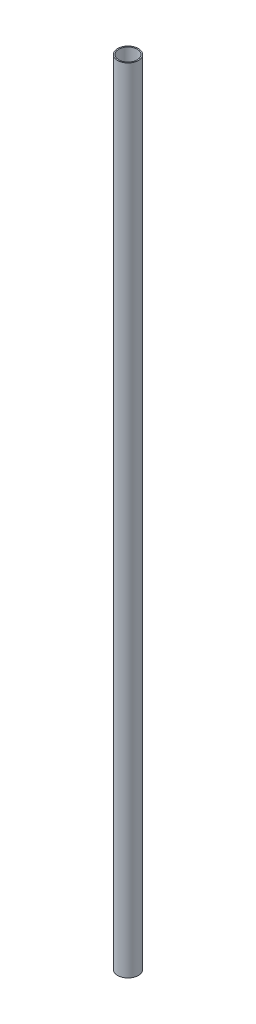
ISO-10303-21;
HEADER;
FILE_DESCRIPTION(('STEP AP214'),'2;1');
FILE_NAME('part.step','',(''),(''),'','','');
FILE_SCHEMA(('AUTOMOTIVE_DESIGN { 1 0 10303 214 1 1 1 1 }'));
ENDSEC;
DATA;
#1=APPLICATION_CONTEXT('core data for automotive mechanical design processes');
#2=APPLICATION_PROTOCOL_DEFINITION('international standard','automotive_design',2000,#1);
#3=PRODUCT_CONTEXT('',#1,'mechanical');
#4=PRODUCT('Part','Part','',(#3));
#5=PRODUCT_RELATED_PRODUCT_CATEGORY('part','',(#4));
#6=PRODUCT_DEFINITION_FORMATION('','',#4);
#7=PRODUCT_DEFINITION_CONTEXT('part definition',#1,'design');
#8=PRODUCT_DEFINITION('design','',#6,#7);
#9=PRODUCT_DEFINITION_SHAPE('','',#8);
#10=(LENGTH_UNIT() NAMED_UNIT(*) SI_UNIT(.MILLI.,.METRE.));
#11=(NAMED_UNIT(*) PLANE_ANGLE_UNIT() SI_UNIT($,.RADIAN.));
#12=(NAMED_UNIT(*) SI_UNIT($,.STERADIAN.) SOLID_ANGLE_UNIT());
#13=UNCERTAINTY_MEASURE_WITH_UNIT(LENGTH_MEASURE(1.E-05),#10,'distance_accuracy_value','');
#14=(GEOMETRIC_REPRESENTATION_CONTEXT(3) GLOBAL_UNCERTAINTY_ASSIGNED_CONTEXT((#13)) GLOBAL_UNIT_ASSIGNED_CONTEXT((#10,
#11,#12)) REPRESENTATION_CONTEXT('',''));
#15=CARTESIAN_POINT('',(0.,0.,0.));
#16=DIRECTION('',(0.,0.,1.));
#17=DIRECTION('',(1.,0.,0.));
#18=AXIS2_PLACEMENT_3D('',#15,#16,#17);
#19=CARTESIAN_POINT('',(0.,-241.3,0.));
#20=DIRECTION('',(0.,1.,0.));
#21=DIRECTION('',(0.,0.,1.));
#22=AXIS2_PLACEMENT_3D('',#19,#20,#21);
#23=CYLINDRICAL_SURFACE('',#22,6.35);
#24=CARTESIAN_POINT('',(0.,-241.3,0.));
#25=DIRECTION('',(0.,1.,0.));
#26=DIRECTION('',(0.,0.,1.));
#27=AXIS2_PLACEMENT_3D('',#24,#25,#26);
#28=CIRCLE('',#27,6.35);
#29=CARTESIAN_POINT('',(0.,-241.3,6.35));
#30=VERTEX_POINT('',#29);
#31=EDGE_CURVE('E10',#30,#30,#28,.T.);
#32=CARTESIAN_POINT('',(0.,241.3,0.));
#33=DIRECTION('',(0.,1.,0.));
#34=DIRECTION('',(0.,0.,1.));
#35=AXIS2_PLACEMENT_3D('',#32,#33,#34);
#36=CIRCLE('',#35,6.35);
#37=CARTESIAN_POINT('',(0.,241.3,6.35));
#38=VERTEX_POINT('',#37);
#39=EDGE_CURVE('E47',#38,#38,#36,.T.);
#40=CARTESIAN_POINT('',(0.,-241.3,6.35));
#41=CARTESIAN_POINT('',(0.,-236.272916666667,6.35));
#42=CARTESIAN_POINT('',(0.,-231.245833333333,6.35));
#43=CARTESIAN_POINT('',(0.,-221.191666666667,6.35));
#44=CARTESIAN_POINT('',(0.,-216.164583333333,6.35));
#45=CARTESIAN_POINT('',(0.,-206.110416666667,6.35));
#46=CARTESIAN_POINT('',(0.,-201.083333333333,6.35));
#47=CARTESIAN_POINT('',(0.,-191.029166666667,6.35));
#48=CARTESIAN_POINT('',(0.,-186.002083333333,6.35));
#49=CARTESIAN_POINT('',(0.,-175.947916666667,6.35));
#50=CARTESIAN_POINT('',(0.,-170.920833333333,6.35));
#51=CARTESIAN_POINT('',(0.,-160.866666666667,6.35));
#52=CARTESIAN_POINT('',(0.,-155.839583333333,6.35));
#53=CARTESIAN_POINT('',(0.,-145.785416666667,6.35));
#54=CARTESIAN_POINT('',(0.,-140.758333333333,6.35));
#55=CARTESIAN_POINT('',(0.,-130.704166666667,6.35));
#56=CARTESIAN_POINT('',(0.,-125.677083333333,6.35));
#57=CARTESIAN_POINT('',(0.,-115.622916666667,6.35));
#58=CARTESIAN_POINT('',(0.,-110.595833333333,6.35));
#59=CARTESIAN_POINT('',(0.,-100.541666666667,6.35));
#60=CARTESIAN_POINT('',(0.,-95.5145833333334,6.35));
#61=CARTESIAN_POINT('',(0.,-85.4604166666667,6.35));
#62=CARTESIAN_POINT('',(0.,-80.4333333333334,6.35));
#63=CARTESIAN_POINT('',(0.,-70.3791666666667,6.35));
#64=CARTESIAN_POINT('',(0.,-65.3520833333334,6.35));
#65=CARTESIAN_POINT('',(0.,-55.2979166666667,6.35));
#66=CARTESIAN_POINT('',(0.,-50.2708333333334,6.35));
#67=CARTESIAN_POINT('',(0.,-40.2166666666667,6.35));
#68=CARTESIAN_POINT('',(0.,-35.1895833333334,6.35));
#69=CARTESIAN_POINT('',(0.,-25.1354166666667,6.35));
#70=CARTESIAN_POINT('',(0.,-20.1083333333334,6.35));
#71=CARTESIAN_POINT('',(0.,-10.0541666666667,6.35));
#72=CARTESIAN_POINT('',(0.,-5.02708333333336,6.35));
#73=CARTESIAN_POINT('',(0.,5.0270833333333,6.35));
#74=CARTESIAN_POINT('',(0.,10.0541666666666,6.35));
#75=CARTESIAN_POINT('',(0.,20.1083333333333,6.35));
#76=CARTESIAN_POINT('',(0.,25.1354166666666,6.35));
#77=CARTESIAN_POINT('',(0.,35.1895833333333,6.35));
#78=CARTESIAN_POINT('',(0.,40.2166666666666,6.35));
#79=CARTESIAN_POINT('',(0.,50.2708333333333,6.35));
#80=CARTESIAN_POINT('',(0.,55.2979166666667,6.35));
#81=CARTESIAN_POINT('',(0.,65.3520833333333,6.35));
#82=CARTESIAN_POINT('',(0.,70.3791666666666,6.35));
#83=CARTESIAN_POINT('',(0.,80.4333333333333,6.35));
#84=CARTESIAN_POINT('',(0.,85.4604166666666,6.35));
#85=CARTESIAN_POINT('',(0.,95.5145833333333,6.35));
#86=CARTESIAN_POINT('',(0.,100.541666666667,6.35));
#87=CARTESIAN_POINT('',(0.,110.595833333333,6.35));
#88=CARTESIAN_POINT('',(0.,115.622916666667,6.35));
#89=CARTESIAN_POINT('',(0.,125.677083333333,6.35));
#90=CARTESIAN_POINT('',(0.,130.704166666667,6.35));
#91=CARTESIAN_POINT('',(0.,140.758333333333,6.35));
#92=CARTESIAN_POINT('',(0.,145.785416666667,6.35));
#93=CARTESIAN_POINT('',(0.,155.839583333333,6.35));
#94=CARTESIAN_POINT('',(0.,160.866666666667,6.35));
#95=CARTESIAN_POINT('',(0.,170.920833333333,6.35));
#96=CARTESIAN_POINT('',(0.,175.947916666667,6.35));
#97=CARTESIAN_POINT('',(0.,186.002083333333,6.35));
#98=CARTESIAN_POINT('',(0.,191.029166666667,6.35));
#99=CARTESIAN_POINT('',(0.,201.083333333333,6.35));
#100=CARTESIAN_POINT('',(0.,206.110416666667,6.35));
#101=CARTESIAN_POINT('',(0.,216.164583333333,6.35));
#102=CARTESIAN_POINT('',(0.,221.191666666667,6.35));
#103=CARTESIAN_POINT('',(0.,231.245833333333,6.35));
#104=CARTESIAN_POINT('',(0.,236.272916666667,6.35));
#105=CARTESIAN_POINT('',(0.,241.3,6.35));
#106=B_SPLINE_CURVE_WITH_KNOTS('',3,(#40,#41,#42,#43,#44,#45,#46,#47,#48,#49,#50,#51,#52,#53,
#54,#55,#56,#57,#58,#59,#60,#61,#62,#63,#64,#65,#66,#67,#68,#69,#70,#71,#72,#73,#74,#75,#76,#77,
#78,#79,#80,#81,#82,#83,#84,#85,#86,#87,#88,#89,#90,#91,#92,#93,#94,#95,#96,#97,#98,#99,#100,
#101,#102,#103,#104,#105),.UNSPECIFIED.,.F.,.F.,(4,2,2,2,2,2,2,2,2,2,2,2,2,2,2,2,2,2,2,2,2,2,2,
2,2,2,2,2,2,2,2,2,4),(0.,15.08125,30.1625,45.24375,60.325,75.40625,90.4875,105.56875,120.65,
135.73125,150.8125,165.89375,180.975,196.05625,211.1375,226.21875,241.3,256.38125,271.4625,
286.54375,301.625,316.70625,331.7875,346.86875,361.95,377.03125,392.1125,407.19375,422.275,
437.35625,452.4375,467.51875,482.6),.UNSPECIFIED.);
#107=EDGE_CURVE('BSEAM37',#30,#38,#106,.T.);
#108=ORIENTED_EDGE('',*,*,#31,.T.);
#109=ORIENTED_EDGE('',*,*,#39,.F.);
#110=ORIENTED_EDGE('',*,*,#107,.T.);
#111=ORIENTED_EDGE('',*,*,#107,.F.);
#112=EDGE_LOOP('',(#108,#110,#109,#111));
#113=FACE_BOUND('',#112,.T.);
#114=ADVANCED_FACE('F37',(#113),#23,.T.);
#115=CARTESIAN_POINT('',(0.,-241.3,0.));
#116=DIRECTION('',(0.,1.,0.));
#117=DIRECTION('',(0.,0.,1.));
#118=AXIS2_PLACEMENT_3D('',#115,#116,#117);
#119=PLANE('',#118);
#120=CARTESIAN_POINT('',(0.,-241.3,0.));
#121=DIRECTION('',(0.,1.,0.));
#122=DIRECTION('',(0.,0.,1.));
#123=AXIS2_PLACEMENT_3D('',#120,#121,#122);
#124=CIRCLE('',#123,5.6134);
#125=CARTESIAN_POINT('',(0.,-241.3,5.6134));
#126=VERTEX_POINT('',#125);
#127=EDGE_CURVE('E43',#126,#126,#124,.T.);
#128=ORIENTED_EDGE('',*,*,#127,.T.);
#129=EDGE_LOOP('',(#128));
#130=FACE_BOUND('',#129,.T.);
#131=ORIENTED_EDGE('',*,*,#31,.F.);
#132=EDGE_LOOP('',(#131));
#133=FACE_BOUND('',#132,.T.);
#134=ADVANCED_FACE('F66',(#130,#133),#119,.F.);
#135=CARTESIAN_POINT('',(0.,-241.3,0.));
#136=DIRECTION('',(0.,1.,0.));
#137=DIRECTION('',(0.,0.,1.));
#138=AXIS2_PLACEMENT_3D('',#135,#136,#137);
#139=CYLINDRICAL_SURFACE('',#138,5.6134);
#140=CARTESIAN_POINT('',(0.,241.3,0.));
#141=DIRECTION('',(0.,1.,0.));
#142=DIRECTION('',(0.,0.,1.));
#143=AXIS2_PLACEMENT_3D('',#140,#141,#142);
#144=CIRCLE('',#143,5.6134);
#145=CARTESIAN_POINT('',(0.,241.3,5.6134));
#146=VERTEX_POINT('',#145);
#147=EDGE_CURVE('E51',#146,#146,#144,.T.);
#148=CARTESIAN_POINT('',(0.,-241.3,5.6134));
#149=CARTESIAN_POINT('',(0.,-236.272916666667,5.6134));
#150=CARTESIAN_POINT('',(0.,-231.245833333333,5.6134));
#151=CARTESIAN_POINT('',(0.,-221.191666666667,5.6134));
#152=CARTESIAN_POINT('',(0.,-216.164583333333,5.6134));
#153=CARTESIAN_POINT('',(0.,-206.110416666667,5.6134));
#154=CARTESIAN_POINT('',(0.,-201.083333333333,5.6134));
#155=CARTESIAN_POINT('',(0.,-191.029166666667,5.6134));
#156=CARTESIAN_POINT('',(0.,-186.002083333333,5.6134));
#157=CARTESIAN_POINT('',(0.,-175.947916666667,5.6134));
#158=CARTESIAN_POINT('',(0.,-170.920833333333,5.6134));
#159=CARTESIAN_POINT('',(0.,-160.866666666667,5.6134));
#160=CARTESIAN_POINT('',(0.,-155.839583333333,5.6134));
#161=CARTESIAN_POINT('',(0.,-145.785416666667,5.6134));
#162=CARTESIAN_POINT('',(0.,-140.758333333333,5.6134));
#163=CARTESIAN_POINT('',(0.,-130.704166666667,5.6134));
#164=CARTESIAN_POINT('',(0.,-125.677083333333,5.6134));
#165=CARTESIAN_POINT('',(0.,-115.622916666667,5.6134));
#166=CARTESIAN_POINT('',(0.,-110.595833333333,5.6134));
#167=CARTESIAN_POINT('',(0.,-100.541666666667,5.6134));
#168=CARTESIAN_POINT('',(0.,-95.5145833333333,5.6134));
#169=CARTESIAN_POINT('',(0.,-85.4604166666667,5.6134));
#170=CARTESIAN_POINT('',(0.,-80.4333333333333,5.6134));
#171=CARTESIAN_POINT('',(0.,-70.3791666666667,5.6134));
#172=CARTESIAN_POINT('',(0.,-65.3520833333334,5.6134));
#173=CARTESIAN_POINT('',(0.,-55.2979166666667,5.6134));
#174=CARTESIAN_POINT('',(0.,-50.2708333333333,5.6134));
#175=CARTESIAN_POINT('',(0.,-40.2166666666667,5.6134));
#176=CARTESIAN_POINT('',(0.,-35.1895833333333,5.6134));
#177=CARTESIAN_POINT('',(0.,-25.1354166666667,5.6134));
#178=CARTESIAN_POINT('',(0.,-20.1083333333333,5.6134));
#179=CARTESIAN_POINT('',(0.,-10.0541666666667,5.6134));
#180=CARTESIAN_POINT('',(0.,-5.02708333333333,5.6134));
#181=CARTESIAN_POINT('',(0.,5.02708333333332,5.6134));
#182=CARTESIAN_POINT('',(0.,10.0541666666666,5.6134));
#183=CARTESIAN_POINT('',(0.,20.1083333333333,5.6134));
#184=CARTESIAN_POINT('',(0.,25.1354166666666,5.6134));
#185=CARTESIAN_POINT('',(0.,35.1895833333333,5.6134));
#186=CARTESIAN_POINT('',(0.,40.2166666666666,5.6134));
#187=CARTESIAN_POINT('',(0.,50.2708333333333,5.6134));
#188=CARTESIAN_POINT('',(0.,55.2979166666667,5.6134));
#189=CARTESIAN_POINT('',(0.,65.3520833333333,5.6134));
#190=CARTESIAN_POINT('',(0.,70.3791666666666,5.6134));
#191=CARTESIAN_POINT('',(0.,80.4333333333333,5.6134));
#192=CARTESIAN_POINT('',(0.,85.4604166666666,5.6134));
#193=CARTESIAN_POINT('',(0.,95.5145833333333,5.6134));
#194=CARTESIAN_POINT('',(0.,100.541666666667,5.6134));
#195=CARTESIAN_POINT('',(0.,110.595833333333,5.6134));
#196=CARTESIAN_POINT('',(0.,115.622916666667,5.6134));
#197=CARTESIAN_POINT('',(0.,125.677083333333,5.6134));
#198=CARTESIAN_POINT('',(0.,130.704166666667,5.6134));
#199=CARTESIAN_POINT('',(0.,140.758333333333,5.6134));
#200=CARTESIAN_POINT('',(0.,145.785416666667,5.6134));
#201=CARTESIAN_POINT('',(0.,155.839583333333,5.6134));
#202=CARTESIAN_POINT('',(0.,160.866666666667,5.6134));
#203=CARTESIAN_POINT('',(0.,170.920833333333,5.6134));
#204=CARTESIAN_POINT('',(0.,175.947916666667,5.6134));
#205=CARTESIAN_POINT('',(0.,186.002083333333,5.6134));
#206=CARTESIAN_POINT('',(0.,191.029166666667,5.6134));
#207=CARTESIAN_POINT('',(0.,201.083333333333,5.6134));
#208=CARTESIAN_POINT('',(0.,206.110416666667,5.6134));
#209=CARTESIAN_POINT('',(0.,216.164583333333,5.6134));
#210=CARTESIAN_POINT('',(0.,221.191666666667,5.6134));
#211=CARTESIAN_POINT('',(0.,231.245833333333,5.6134));
#212=CARTESIAN_POINT('',(0.,236.272916666667,5.6134));
#213=CARTESIAN_POINT('',(0.,241.3,5.6134));
#214=B_SPLINE_CURVE_WITH_KNOTS('',3,(#148,#149,#150,#151,#152,#153,#154,#155,#156,#157,#158,
#159,#160,#161,#162,#163,#164,#165,#166,#167,#168,#169,#170,#171,#172,#173,#174,#175,#176,#177,
#178,#179,#180,#181,#182,#183,#184,#185,#186,#187,#188,#189,#190,#191,#192,#193,#194,#195,#196,
#197,#198,#199,#200,#201,#202,#203,#204,#205,#206,#207,#208,#209,#210,#211,#212,#213),
.UNSPECIFIED.,.F.,.F.,(4,2,2,2,2,2,2,2,2,2,2,2,2,2,2,2,2,2,2,2,2,2,2,2,2,2,2,2,2,2,2,2,4),(0.,
15.08125,30.1625,45.24375,60.325,75.40625,90.4875,105.56875,120.65,135.73125,150.8125,165.89375,
180.975,196.05625,211.1375,226.21875,241.3,256.38125,271.4625,286.54375,301.625,316.70625,
331.7875,346.86875,361.95,377.03125,392.1125,407.19375,422.275,437.35625,452.4375,467.51875,
482.6),.UNSPECIFIED.);
#215=EDGE_CURVE('BSEAM57',#126,#146,#214,.T.);
#216=ORIENTED_EDGE('',*,*,#127,.F.);
#217=ORIENTED_EDGE('',*,*,#147,.T.);
#218=ORIENTED_EDGE('',*,*,#215,.T.);
#219=ORIENTED_EDGE('',*,*,#215,.F.);
#220=EDGE_LOOP('',(#216,#218,#217,#219));
#221=FACE_BOUND('',#220,.T.);
#222=ADVANCED_FACE('F57',(#221),#139,.F.);
#223=CARTESIAN_POINT('',(0.,241.3,0.));
#224=DIRECTION('',(0.,1.,0.));
#225=DIRECTION('',(0.,0.,1.));
#226=AXIS2_PLACEMENT_3D('',#223,#224,#225);
#227=PLANE('',#226);
#228=ORIENTED_EDGE('',*,*,#39,.T.);
#229=EDGE_LOOP('',(#228));
#230=FACE_BOUND('',#229,.T.);
#231=ORIENTED_EDGE('',*,*,#147,.F.);
#232=EDGE_LOOP('',(#231));
#233=FACE_BOUND('',#232,.T.);
#234=ADVANCED_FACE('F59',(#230,#233),#227,.T.);
#235=CLOSED_SHELL('',(#114,#134,#222,#234));
#236=MANIFOLD_SOLID_BREP('B2',#235);
#237=ADVANCED_BREP_SHAPE_REPRESENTATION('',(#18,#236),#14);
#238=SHAPE_DEFINITION_REPRESENTATION(#9,#237);
ENDSEC;
END-ISO-10303-21;
